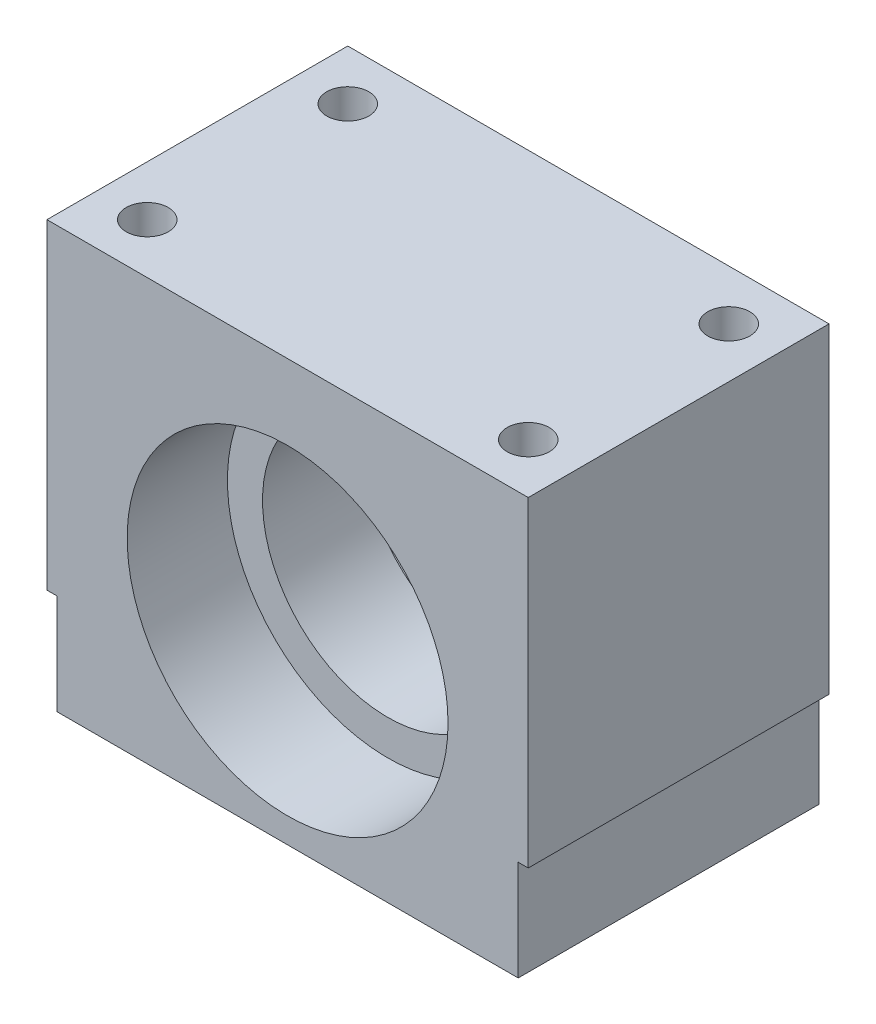
ISO-10303-21;
HEADER;
FILE_DESCRIPTION(('STEP AP214'),'2;1');
FILE_NAME('part.step','',(''),(''),'','','');
FILE_SCHEMA(('AUTOMOTIVE_DESIGN { 1 0 10303 214 1 1 1 1 }'));
ENDSEC;
DATA;
#1=APPLICATION_CONTEXT('core data for automotive mechanical design processes');
#2=APPLICATION_PROTOCOL_DEFINITION('international standard','automotive_design',2000,#1);
#3=PRODUCT_CONTEXT('',#1,'mechanical');
#4=PRODUCT('Part','Part','',(#3));
#5=PRODUCT_RELATED_PRODUCT_CATEGORY('part','',(#4));
#6=PRODUCT_DEFINITION_FORMATION('','',#4);
#7=PRODUCT_DEFINITION_CONTEXT('part definition',#1,'design');
#8=PRODUCT_DEFINITION('design','',#6,#7);
#9=PRODUCT_DEFINITION_SHAPE('','',#8);
#10=(LENGTH_UNIT() NAMED_UNIT(*) SI_UNIT(.MILLI.,.METRE.));
#11=(NAMED_UNIT(*) PLANE_ANGLE_UNIT() SI_UNIT($,.RADIAN.));
#12=(NAMED_UNIT(*) SI_UNIT($,.STERADIAN.) SOLID_ANGLE_UNIT());
#13=UNCERTAINTY_MEASURE_WITH_UNIT(LENGTH_MEASURE(1.E-05),#10,'distance_accuracy_value','');
#14=(GEOMETRIC_REPRESENTATION_CONTEXT(3) GLOBAL_UNCERTAINTY_ASSIGNED_CONTEXT((#13)) GLOBAL_UNIT_ASSIGNED_CONTEXT((#10,
#11,#12)) REPRESENTATION_CONTEXT('',''));
#15=CARTESIAN_POINT('',(0.,0.,0.));
#16=DIRECTION('',(0.,0.,1.));
#17=DIRECTION('',(1.,0.,0.));
#18=AXIS2_PLACEMENT_3D('',#15,#16,#17);
#19=CARTESIAN_POINT('',(0.,18.5,-15.));
#20=DIRECTION('',(0.,0.,1.));
#21=DIRECTION('',(1.,0.,0.));
#22=AXIS2_PLACEMENT_3D('',#19,#20,#21);
#23=CYLINDRICAL_SURFACE('',#22,12.5);
#24=CARTESIAN_POINT('',(0.,18.5,5.));
#25=DIRECTION('',(0.,0.,1.));
#26=DIRECTION('',(1.,0.,0.));
#27=AXIS2_PLACEMENT_3D('',#24,#25,#26);
#28=CIRCLE('',#27,12.5);
#29=CARTESIAN_POINT('',(12.5,18.5,5.));
#30=VERTEX_POINT('',#29);
#31=EDGE_CURVE('E191',#30,#30,#28,.F.);
#32=ORIENTED_EDGE('',*,*,#31,.F.);
#33=EDGE_LOOP('',(#32));
#34=FACE_BOUND('',#33,.T.);
#35=CARTESIAN_POINT('',(0.,18.5,-5.));
#36=DIRECTION('',(0.,0.,-1.));
#37=DIRECTION('',(-1.,0.,0.));
#38=AXIS2_PLACEMENT_3D('',#35,#36,#37);
#39=CIRCLE('',#38,12.5);
#40=CARTESIAN_POINT('',(-12.5,18.5,-5.));
#41=VERTEX_POINT('',#40);
#42=EDGE_CURVE('E36',#41,#41,#39,.F.);
#43=ORIENTED_EDGE('',*,*,#42,.F.);
#44=EDGE_LOOP('',(#43));
#45=FACE_BOUND('',#44,.T.);
#46=ADVANCED_FACE('F32',(#34,#45),#23,.F.);
#47=CARTESIAN_POINT('',(-24.,42.,-15.));
#48=DIRECTION('',(0.,0.,1.));
#49=DIRECTION('',(1.,0.,0.));
#50=AXIS2_PLACEMENT_3D('',#47,#48,#49);
#51=PLANE('',#50);
#52=DIRECTION('',(-1.,0.,0.));
#53=VECTOR('',#52,1.);
#54=CARTESIAN_POINT('',(-24.,0.,-15.));
#55=LINE('',#54,#53);
#56=CARTESIAN_POINT('',(23.,0.,-15.));
#57=VERTEX_POINT('',#56);
#58=CARTESIAN_POINT('',(-23.,0.,-15.));
#59=VERTEX_POINT('',#58);
#60=EDGE_CURVE('E132',#57,#59,#55,.T.);
#61=ORIENTED_EDGE('',*,*,#60,.T.);
#62=DIRECTION('',(0.,1.,0.));
#63=VECTOR('',#62,1.);
#64=CARTESIAN_POINT('',(-23.,10.,-15.));
#65=LINE('',#64,#63);
#66=CARTESIAN_POINT('',(-23.,10.,-15.));
#67=VERTEX_POINT('',#66);
#68=EDGE_CURVE('E49',#59,#67,#65,.T.);
#69=ORIENTED_EDGE('',*,*,#68,.T.);
#70=DIRECTION('',(-1.,0.,0.));
#71=VECTOR('',#70,1.);
#72=CARTESIAN_POINT('',(-24.,10.,-15.));
#73=LINE('',#72,#71);
#74=CARTESIAN_POINT('',(-24.,10.,-15.));
#75=VERTEX_POINT('',#74);
#76=EDGE_CURVE('E118',#67,#75,#73,.T.);
#77=ORIENTED_EDGE('',*,*,#76,.T.);
#78=DIRECTION('',(0.,-1.,0.));
#79=VECTOR('',#78,1.);
#80=CARTESIAN_POINT('',(-24.,42.,-15.));
#81=LINE('',#80,#79);
#82=CARTESIAN_POINT('',(-24.,42.,-15.));
#83=VERTEX_POINT('',#82);
#84=EDGE_CURVE('E41',#83,#75,#81,.T.);
#85=ORIENTED_EDGE('',*,*,#84,.F.);
#86=DIRECTION('',(-1.,0.,0.));
#87=VECTOR('',#86,1.);
#88=CARTESIAN_POINT('',(-24.,42.,-15.));
#89=LINE('',#88,#87);
#90=CARTESIAN_POINT('',(24.,42.,-15.));
#91=VERTEX_POINT('',#90);
#92=EDGE_CURVE('E198',#91,#83,#89,.T.);
#93=ORIENTED_EDGE('',*,*,#92,.F.);
#94=DIRECTION('',(0.,-1.,0.));
#95=VECTOR('',#94,1.);
#96=CARTESIAN_POINT('',(24.,42.,-15.));
#97=LINE('',#96,#95);
#98=CARTESIAN_POINT('',(24.,10.,-15.));
#99=VERTEX_POINT('',#98);
#100=EDGE_CURVE('E11',#91,#99,#97,.T.);
#101=ORIENTED_EDGE('',*,*,#100,.T.);
#102=DIRECTION('',(-1.,0.,0.));
#103=VECTOR('',#102,1.);
#104=CARTESIAN_POINT('',(24.,10.,-15.));
#105=LINE('',#104,#103);
#106=CARTESIAN_POINT('',(23.,10.,-15.));
#107=VERTEX_POINT('',#106);
#108=EDGE_CURVE('E142',#99,#107,#105,.T.);
#109=ORIENTED_EDGE('',*,*,#108,.T.);
#110=DIRECTION('',(0.,-1.,0.));
#111=VECTOR('',#110,1.);
#112=CARTESIAN_POINT('',(23.,10.,-15.));
#113=LINE('',#112,#111);
#114=EDGE_CURVE('E145',#107,#57,#113,.T.);
#115=ORIENTED_EDGE('',*,*,#114,.T.);
#116=EDGE_LOOP('',(#61,#69,#77,#85,#93,#101,#109,#115));
#117=FACE_BOUND('',#116,.T.);
#118=CARTESIAN_POINT('',(0.,18.5,-15.));
#119=DIRECTION('',(0.,0.,1.));
#120=DIRECTION('',(1.,0.,0.));
#121=AXIS2_PLACEMENT_3D('',#118,#119,#120);
#122=CIRCLE('',#121,16.);
#123=CARTESIAN_POINT('',(16.,18.5,-15.));
#124=VERTEX_POINT('',#123);
#125=EDGE_CURVE('E182',#124,#124,#122,.T.);
#126=ORIENTED_EDGE('',*,*,#125,.T.);
#127=EDGE_LOOP('',(#126));
#128=FACE_BOUND('',#127,.T.);
#129=ADVANCED_FACE('F128',(#117,#128),#51,.F.);
#130=CARTESIAN_POINT('',(24.,42.,15.));
#131=DIRECTION('',(-1.,0.,0.));
#132=DIRECTION('',(0.,0.,1.));
#133=AXIS2_PLACEMENT_3D('',#130,#131,#132);
#134=PLANE('',#133);
#135=DIRECTION('',(0.,-1.,0.));
#136=VECTOR('',#135,1.);
#137=CARTESIAN_POINT('',(24.,42.,15.));
#138=LINE('',#137,#136);
#139=CARTESIAN_POINT('',(24.,42.,15.));
#140=VERTEX_POINT('',#139);
#141=CARTESIAN_POINT('',(24.,10.,15.));
#142=VERTEX_POINT('',#141);
#143=EDGE_CURVE('E204',#140,#142,#138,.T.);
#144=ORIENTED_EDGE('',*,*,#143,.T.);
#145=DIRECTION('',(0.,0.,1.));
#146=VECTOR('',#145,1.);
#147=CARTESIAN_POINT('',(24.,10.,-15.));
#148=LINE('',#147,#146);
#149=EDGE_CURVE('E148',#99,#142,#148,.T.);
#150=ORIENTED_EDGE('',*,*,#149,.F.);
#151=ORIENTED_EDGE('',*,*,#100,.F.);
#152=DIRECTION('',(0.,0.,-1.));
#153=VECTOR('',#152,1.);
#154=CARTESIAN_POINT('',(24.,42.,15.));
#155=LINE('',#154,#153);
#156=EDGE_CURVE('E195',#140,#91,#155,.T.);
#157=ORIENTED_EDGE('',*,*,#156,.F.);
#158=EDGE_LOOP('',(#144,#150,#151,#157));
#159=FACE_BOUND('',#158,.T.);
#160=ADVANCED_FACE('F34',(#159),#134,.F.);
#161=CARTESIAN_POINT('',(-24.,42.,15.));
#162=DIRECTION('',(1.,0.,0.));
#163=DIRECTION('',(0.,0.,-1.));
#164=AXIS2_PLACEMENT_3D('',#161,#162,#163);
#165=PLANE('',#164);
#166=ORIENTED_EDGE('',*,*,#84,.T.);
#167=DIRECTION('',(0.,0.,1.));
#168=VECTOR('',#167,1.);
#169=CARTESIAN_POINT('',(-24.,10.,-15.));
#170=LINE('',#169,#168);
#171=CARTESIAN_POINT('',(-24.,10.,15.));
#172=VERTEX_POINT('',#171);
#173=EDGE_CURVE('E117',#75,#172,#170,.T.);
#174=ORIENTED_EDGE('',*,*,#173,.T.);
#175=DIRECTION('',(0.,-1.,0.));
#176=VECTOR('',#175,1.);
#177=CARTESIAN_POINT('',(-24.,42.,15.));
#178=LINE('',#177,#176);
#179=CARTESIAN_POINT('',(-24.,42.,15.));
#180=VERTEX_POINT('',#179);
#181=EDGE_CURVE('E209',#180,#172,#178,.T.);
#182=ORIENTED_EDGE('',*,*,#181,.F.);
#183=DIRECTION('',(0.,0.,1.));
#184=VECTOR('',#183,1.);
#185=CARTESIAN_POINT('',(-24.,42.,15.));
#186=LINE('',#185,#184);
#187=EDGE_CURVE('E200',#83,#180,#186,.T.);
#188=ORIENTED_EDGE('',*,*,#187,.F.);
#189=EDGE_LOOP('',(#166,#174,#182,#188));
#190=FACE_BOUND('',#189,.T.);
#191=ADVANCED_FACE('F256',(#190),#165,.F.);
#192=CARTESIAN_POINT('',(-24.,42.,15.));
#193=DIRECTION('',(0.,0.,-1.));
#194=DIRECTION('',(-1.,0.,0.));
#195=AXIS2_PLACEMENT_3D('',#192,#193,#194);
#196=PLANE('',#195);
#197=CARTESIAN_POINT('',(0.,18.5,15.));
#198=DIRECTION('',(0.,0.,1.));
#199=DIRECTION('',(1.,0.,0.));
#200=AXIS2_PLACEMENT_3D('',#197,#198,#199);
#201=CIRCLE('',#200,16.);
#202=CARTESIAN_POINT('',(16.,18.5,15.));
#203=VERTEX_POINT('',#202);
#204=EDGE_CURVE('E192',#203,#203,#201,.T.);
#205=ORIENTED_EDGE('',*,*,#204,.F.);
#206=EDGE_LOOP('',(#205));
#207=FACE_BOUND('',#206,.T.);
#208=DIRECTION('',(-1.,0.,0.));
#209=VECTOR('',#208,1.);
#210=CARTESIAN_POINT('',(-24.,10.,15.));
#211=LINE('',#210,#209);
#212=CARTESIAN_POINT('',(-23.,10.,15.));
#213=VERTEX_POINT('',#212);
#214=EDGE_CURVE('E133',#213,#172,#211,.T.);
#215=ORIENTED_EDGE('',*,*,#214,.F.);
#216=DIRECTION('',(0.,1.,0.));
#217=VECTOR('',#216,1.);
#218=CARTESIAN_POINT('',(-23.,10.,15.));
#219=LINE('',#218,#217);
#220=CARTESIAN_POINT('',(-23.,0.,15.));
#221=VERTEX_POINT('',#220);
#222=EDGE_CURVE('E114',#221,#213,#219,.T.);
#223=ORIENTED_EDGE('',*,*,#222,.F.);
#224=DIRECTION('',(1.,0.,0.));
#225=VECTOR('',#224,1.);
#226=CARTESIAN_POINT('',(-24.,0.,15.));
#227=LINE('',#226,#225);
#228=CARTESIAN_POINT('',(23.,0.,15.));
#229=VERTEX_POINT('',#228);
#230=EDGE_CURVE('E57',#221,#229,#227,.T.);
#231=ORIENTED_EDGE('',*,*,#230,.T.);
#232=DIRECTION('',(0.,-1.,0.));
#233=VECTOR('',#232,1.);
#234=CARTESIAN_POINT('',(23.,10.,15.));
#235=LINE('',#234,#233);
#236=CARTESIAN_POINT('',(23.,10.,15.));
#237=VERTEX_POINT('',#236);
#238=EDGE_CURVE('E146',#237,#229,#235,.T.);
#239=ORIENTED_EDGE('',*,*,#238,.F.);
#240=DIRECTION('',(-1.,0.,0.));
#241=VECTOR('',#240,1.);
#242=CARTESIAN_POINT('',(24.,10.,15.));
#243=LINE('',#242,#241);
#244=EDGE_CURVE('E140',#142,#237,#243,.T.);
#245=ORIENTED_EDGE('',*,*,#244,.F.);
#246=ORIENTED_EDGE('',*,*,#143,.F.);
#247=DIRECTION('',(1.,0.,0.));
#248=VECTOR('',#247,1.);
#249=CARTESIAN_POINT('',(-24.,42.,15.));
#250=LINE('',#249,#248);
#251=EDGE_CURVE('E202',#180,#140,#250,.T.);
#252=ORIENTED_EDGE('',*,*,#251,.F.);
#253=ORIENTED_EDGE('',*,*,#181,.T.);
#254=EDGE_LOOP('',(#215,#223,#231,#239,#245,#246,#252,#253));
#255=FACE_BOUND('',#254,.T.);
#256=ADVANCED_FACE('F249',(#207,#255),#196,.F.);
#257=CARTESIAN_POINT('',(0.,42.,0.));
#258=DIRECTION('',(0.,-1.,0.));
#259=DIRECTION('',(0.,0.,-1.));
#260=AXIS2_PLACEMENT_3D('',#257,#258,#259);
#261=PLANE('',#260);
#262=CARTESIAN_POINT('',(-19.,42.,10.));
#263=DIRECTION('',(0.,1.,0.));
#264=DIRECTION('',(0.,0.,1.));
#265=AXIS2_PLACEMENT_3D('',#262,#263,#264);
#266=CIRCLE('',#265,2.09999999999999);
#267=CARTESIAN_POINT('',(-19.,42.,12.1));
#268=VERTEX_POINT('',#267);
#269=EDGE_CURVE('E155',#268,#268,#266,.T.);
#270=ORIENTED_EDGE('',*,*,#269,.F.);
#271=EDGE_LOOP('',(#270));
#272=FACE_BOUND('',#271,.T.);
#273=CARTESIAN_POINT('',(-19.,42.,-10.));
#274=DIRECTION('',(0.,1.,0.));
#275=DIRECTION('',(0.,0.,1.));
#276=AXIS2_PLACEMENT_3D('',#273,#274,#275);
#277=CIRCLE('',#276,2.09999999999999);
#278=CARTESIAN_POINT('',(-19.,42.,-7.90000000000001));
#279=VERTEX_POINT('',#278);
#280=EDGE_CURVE('E164',#279,#279,#277,.T.);
#281=ORIENTED_EDGE('',*,*,#280,.F.);
#282=EDGE_LOOP('',(#281));
#283=FACE_BOUND('',#282,.T.);
#284=CARTESIAN_POINT('',(19.,42.,10.));
#285=DIRECTION('',(0.,1.,0.));
#286=DIRECTION('',(0.,0.,1.));
#287=AXIS2_PLACEMENT_3D('',#284,#285,#286);
#288=CIRCLE('',#287,2.09999999999999);
#289=CARTESIAN_POINT('',(19.,42.,12.1));
#290=VERTEX_POINT('',#289);
#291=EDGE_CURVE('E170',#290,#290,#288,.T.);
#292=ORIENTED_EDGE('',*,*,#291,.F.);
#293=EDGE_LOOP('',(#292));
#294=FACE_BOUND('',#293,.T.);
#295=CARTESIAN_POINT('',(19.,42.,-10.));
#296=DIRECTION('',(0.,1.,0.));
#297=DIRECTION('',(0.,0.,1.));
#298=AXIS2_PLACEMENT_3D('',#295,#296,#297);
#299=CIRCLE('',#298,2.09999999999999);
#300=CARTESIAN_POINT('',(19.,42.,-7.90000000000001));
#301=VERTEX_POINT('',#300);
#302=EDGE_CURVE('E176',#301,#301,#299,.T.);
#303=ORIENTED_EDGE('',*,*,#302,.F.);
#304=EDGE_LOOP('',(#303));
#305=FACE_BOUND('',#304,.T.);
#306=ORIENTED_EDGE('',*,*,#156,.T.);
#307=ORIENTED_EDGE('',*,*,#92,.T.);
#308=ORIENTED_EDGE('',*,*,#187,.T.);
#309=ORIENTED_EDGE('',*,*,#251,.T.);
#310=EDGE_LOOP('',(#306,#307,#308,#309));
#311=FACE_BOUND('',#310,.T.);
#312=ADVANCED_FACE('F246',(#272,#283,#294,#305,#311),#261,.F.);
#313=CARTESIAN_POINT('',(0.,0.,0.));
#314=DIRECTION('',(0.,-1.,0.));
#315=DIRECTION('',(0.,0.,-1.));
#316=AXIS2_PLACEMENT_3D('',#313,#314,#315);
#317=PLANE('',#316);
#318=DIRECTION('',(0.,0.,1.));
#319=VECTOR('',#318,1.);
#320=CARTESIAN_POINT('',(-23.,0.,-15.));
#321=LINE('',#320,#319);
#322=EDGE_CURVE('E138',#59,#221,#321,.T.);
#323=ORIENTED_EDGE('',*,*,#322,.F.);
#324=ORIENTED_EDGE('',*,*,#60,.F.);
#325=DIRECTION('',(0.,0.,1.));
#326=VECTOR('',#325,1.);
#327=CARTESIAN_POINT('',(23.,0.,-15.));
#328=LINE('',#327,#326);
#329=EDGE_CURVE('E152',#57,#229,#328,.T.);
#330=ORIENTED_EDGE('',*,*,#329,.T.);
#331=ORIENTED_EDGE('',*,*,#230,.F.);
#332=EDGE_LOOP('',(#323,#324,#330,#331));
#333=FACE_BOUND('',#332,.T.);
#334=ADVANCED_FACE('F243',(#333),#317,.T.);
#335=CARTESIAN_POINT('',(0.,18.5,5.));
#336=DIRECTION('',(0.,0.,1.));
#337=DIRECTION('',(1.,0.,0.));
#338=AXIS2_PLACEMENT_3D('',#335,#336,#337);
#339=PLANE('',#338);
#340=CARTESIAN_POINT('',(0.,18.5,5.));
#341=DIRECTION('',(0.,0.,1.));
#342=DIRECTION('',(1.,0.,0.));
#343=AXIS2_PLACEMENT_3D('',#340,#341,#342);
#344=CIRCLE('',#343,16.);
#345=CARTESIAN_POINT('',(16.,18.5,5.));
#346=VERTEX_POINT('',#345);
#347=EDGE_CURVE('E188',#346,#346,#344,.T.);
#348=ORIENTED_EDGE('',*,*,#347,.T.);
#349=EDGE_LOOP('',(#348));
#350=FACE_BOUND('',#349,.T.);
#351=ORIENTED_EDGE('',*,*,#31,.T.);
#352=EDGE_LOOP('',(#351));
#353=FACE_BOUND('',#352,.T.);
#354=ADVANCED_FACE('F215',(#350,#353),#339,.T.);
#355=CARTESIAN_POINT('',(0.,18.5,5.));
#356=DIRECTION('',(0.,0.,1.));
#357=DIRECTION('',(1.,0.,0.));
#358=AXIS2_PLACEMENT_3D('',#355,#356,#357);
#359=CYLINDRICAL_SURFACE('',#358,16.);
#360=ORIENTED_EDGE('',*,*,#347,.F.);
#361=EDGE_LOOP('',(#360));
#362=FACE_BOUND('',#361,.T.);
#363=ORIENTED_EDGE('',*,*,#204,.T.);
#364=EDGE_LOOP('',(#363));
#365=FACE_BOUND('',#364,.T.);
#366=ADVANCED_FACE('F226',(#362,#365),#359,.F.);
#367=CARTESIAN_POINT('',(0.,18.5,-5.));
#368=DIRECTION('',(0.,0.,-1.));
#369=DIRECTION('',(1.,0.,0.));
#370=AXIS2_PLACEMENT_3D('',#367,#368,#369);
#371=PLANE('',#370);
#372=CARTESIAN_POINT('',(0.,18.5,-5.));
#373=DIRECTION('',(0.,0.,1.));
#374=DIRECTION('',(1.,0.,0.));
#375=AXIS2_PLACEMENT_3D('',#372,#373,#374);
#376=CIRCLE('',#375,16.);
#377=CARTESIAN_POINT('',(16.,18.5,-5.));
#378=VERTEX_POINT('',#377);
#379=EDGE_CURVE('E183',#378,#378,#376,.T.);
#380=ORIENTED_EDGE('',*,*,#379,.F.);
#381=EDGE_LOOP('',(#380));
#382=FACE_BOUND('',#381,.T.);
#383=ORIENTED_EDGE('',*,*,#42,.T.);
#384=EDGE_LOOP('',(#383));
#385=FACE_BOUND('',#384,.T.);
#386=ADVANCED_FACE('F223',(#382,#385),#371,.T.);
#387=CARTESIAN_POINT('',(0.,18.5,-5.));
#388=DIRECTION('',(0.,0.,-1.));
#389=DIRECTION('',(-1.,0.,0.));
#390=AXIS2_PLACEMENT_3D('',#387,#388,#389);
#391=CYLINDRICAL_SURFACE('',#390,16.);
#392=ORIENTED_EDGE('',*,*,#379,.T.);
#393=EDGE_LOOP('',(#392));
#394=FACE_BOUND('',#393,.T.);
#395=ORIENTED_EDGE('',*,*,#125,.F.);
#396=EDGE_LOOP('',(#395));
#397=FACE_BOUND('',#396,.T.);
#398=ADVANCED_FACE('F225',(#394,#397),#391,.F.);
#399=CARTESIAN_POINT('',(19.,7.,-10.));
#400=DIRECTION('',(0.,1.,0.));
#401=DIRECTION('',(0.,0.,1.));
#402=AXIS2_PLACEMENT_3D('',#399,#400,#401);
#403=CONICAL_SURFACE('',#402,2.09999999999998,1.02974425867665);
#404=CARTESIAN_POINT('',(19.,5.73819270004212,-10.));
#405=VERTEX_POINT('',#404);
#406=VERTEX_LOOP('',#405);
#407=FACE_BOUND('',#406,.T.);
#408=CARTESIAN_POINT('',(19.,7.,-10.));
#409=DIRECTION('',(0.,1.,0.));
#410=DIRECTION('',(0.,0.,1.));
#411=AXIS2_PLACEMENT_3D('',#408,#409,#410);
#412=CIRCLE('',#411,2.09999999999998);
#413=CARTESIAN_POINT('',(19.,7.,-7.90000000000001));
#414=VERTEX_POINT('',#413);
#415=EDGE_CURVE('E179',#414,#414,#412,.T.);
#416=ORIENTED_EDGE('',*,*,#415,.T.);
#417=EDGE_LOOP('',(#416));
#418=FACE_BOUND('',#417,.T.);
#419=ADVANCED_FACE('F233',(#407,#418),#403,.F.);
#420=CARTESIAN_POINT('',(19.,42.,-10.));
#421=DIRECTION('',(0.,1.,0.));
#422=DIRECTION('',(0.,0.,1.));
#423=AXIS2_PLACEMENT_3D('',#420,#421,#422);
#424=CYLINDRICAL_SURFACE('',#423,2.09999999999999);
#425=ORIENTED_EDGE('',*,*,#415,.F.);
#426=EDGE_LOOP('',(#425));
#427=FACE_BOUND('',#426,.T.);
#428=ORIENTED_EDGE('',*,*,#302,.T.);
#429=EDGE_LOOP('',(#428));
#430=FACE_BOUND('',#429,.T.);
#431=ADVANCED_FACE('F312',(#427,#430),#424,.F.);
#432=CARTESIAN_POINT('',(19.,7.,10.));
#433=DIRECTION('',(0.,1.,0.));
#434=DIRECTION('',(0.,0.,1.));
#435=AXIS2_PLACEMENT_3D('',#432,#433,#434);
#436=CONICAL_SURFACE('',#435,2.09999999999998,1.02974425867665);
#437=CARTESIAN_POINT('',(19.,5.73819270004212,10.));
#438=VERTEX_POINT('',#437);
#439=VERTEX_LOOP('',#438);
#440=FACE_BOUND('',#439,.T.);
#441=CARTESIAN_POINT('',(19.,7.,10.));
#442=DIRECTION('',(0.,1.,0.));
#443=DIRECTION('',(0.,0.,1.));
#444=AXIS2_PLACEMENT_3D('',#441,#442,#443);
#445=CIRCLE('',#444,2.09999999999998);
#446=CARTESIAN_POINT('',(19.,7.,12.1));
#447=VERTEX_POINT('',#446);
#448=EDGE_CURVE('E173',#447,#447,#445,.T.);
#449=ORIENTED_EDGE('',*,*,#448,.T.);
#450=EDGE_LOOP('',(#449));
#451=FACE_BOUND('',#450,.T.);
#452=ADVANCED_FACE('F309',(#440,#451),#436,.F.);
#453=CARTESIAN_POINT('',(19.,42.,10.));
#454=DIRECTION('',(0.,1.,0.));
#455=DIRECTION('',(0.,0.,1.));
#456=AXIS2_PLACEMENT_3D('',#453,#454,#455);
#457=CYLINDRICAL_SURFACE('',#456,2.09999999999999);
#458=ORIENTED_EDGE('',*,*,#448,.F.);
#459=EDGE_LOOP('',(#458));
#460=FACE_BOUND('',#459,.T.);
#461=ORIENTED_EDGE('',*,*,#291,.T.);
#462=EDGE_LOOP('',(#461));
#463=FACE_BOUND('',#462,.T.);
#464=ADVANCED_FACE('F305',(#460,#463),#457,.F.);
#465=CARTESIAN_POINT('',(-19.,7.,-10.));
#466=DIRECTION('',(0.,1.,0.));
#467=DIRECTION('',(0.,0.,1.));
#468=AXIS2_PLACEMENT_3D('',#465,#466,#467);
#469=CONICAL_SURFACE('',#468,2.09999999999998,1.02974425867665);
#470=CARTESIAN_POINT('',(-19.,5.73819270004212,-10.));
#471=VERTEX_POINT('',#470);
#472=VERTEX_LOOP('',#471);
#473=FACE_BOUND('',#472,.T.);
#474=CARTESIAN_POINT('',(-19.,7.,-10.));
#475=DIRECTION('',(0.,1.,0.));
#476=DIRECTION('',(0.,0.,1.));
#477=AXIS2_PLACEMENT_3D('',#474,#475,#476);
#478=CIRCLE('',#477,2.09999999999998);
#479=CARTESIAN_POINT('',(-19.,7.,-7.90000000000001));
#480=VERTEX_POINT('',#479);
#481=EDGE_CURVE('E167',#480,#480,#478,.T.);
#482=ORIENTED_EDGE('',*,*,#481,.T.);
#483=EDGE_LOOP('',(#482));
#484=FACE_BOUND('',#483,.T.);
#485=ADVANCED_FACE('F301',(#473,#484),#469,.F.);
#486=CARTESIAN_POINT('',(-19.,42.,-10.));
#487=DIRECTION('',(0.,1.,0.));
#488=DIRECTION('',(0.,0.,1.));
#489=AXIS2_PLACEMENT_3D('',#486,#487,#488);
#490=CYLINDRICAL_SURFACE('',#489,2.09999999999999);
#491=ORIENTED_EDGE('',*,*,#481,.F.);
#492=EDGE_LOOP('',(#491));
#493=FACE_BOUND('',#492,.T.);
#494=ORIENTED_EDGE('',*,*,#280,.T.);
#495=EDGE_LOOP('',(#494));
#496=FACE_BOUND('',#495,.T.);
#497=ADVANCED_FACE('F297',(#493,#496),#490,.F.);
#498=CARTESIAN_POINT('',(-19.,7.,10.));
#499=DIRECTION('',(0.,1.,0.));
#500=DIRECTION('',(0.,0.,1.));
#501=AXIS2_PLACEMENT_3D('',#498,#499,#500);
#502=CONICAL_SURFACE('',#501,2.09999999999998,1.02974425867665);
#503=CARTESIAN_POINT('',(-19.,5.73819270004212,10.));
#504=VERTEX_POINT('',#503);
#505=VERTEX_LOOP('',#504);
#506=FACE_BOUND('',#505,.T.);
#507=CARTESIAN_POINT('',(-19.,7.,10.));
#508=DIRECTION('',(0.,1.,0.));
#509=DIRECTION('',(0.,0.,1.));
#510=AXIS2_PLACEMENT_3D('',#507,#508,#509);
#511=CIRCLE('',#510,2.09999999999998);
#512=CARTESIAN_POINT('',(-19.,7.,12.1));
#513=VERTEX_POINT('',#512);
#514=EDGE_CURVE('E161',#513,#513,#511,.T.);
#515=ORIENTED_EDGE('',*,*,#514,.T.);
#516=EDGE_LOOP('',(#515));
#517=FACE_BOUND('',#516,.T.);
#518=ADVANCED_FACE('F289',(#506,#517),#502,.F.);
#519=CARTESIAN_POINT('',(-19.,42.,10.));
#520=DIRECTION('',(0.,1.,0.));
#521=DIRECTION('',(0.,0.,1.));
#522=AXIS2_PLACEMENT_3D('',#519,#520,#521);
#523=CYLINDRICAL_SURFACE('',#522,2.09999999999999);
#524=ORIENTED_EDGE('',*,*,#514,.F.);
#525=EDGE_LOOP('',(#524));
#526=FACE_BOUND('',#525,.T.);
#527=ORIENTED_EDGE('',*,*,#269,.T.);
#528=EDGE_LOOP('',(#527));
#529=FACE_BOUND('',#528,.T.);
#530=ADVANCED_FACE('F282',(#526,#529),#523,.F.);
#531=CARTESIAN_POINT('',(23.,10.,-15.));
#532=DIRECTION('',(-1.,0.,0.));
#533=DIRECTION('',(0.,0.,1.));
#534=AXIS2_PLACEMENT_3D('',#531,#532,#533);
#535=PLANE('',#534);
#536=ORIENTED_EDGE('',*,*,#238,.T.);
#537=ORIENTED_EDGE('',*,*,#329,.F.);
#538=ORIENTED_EDGE('',*,*,#114,.F.);
#539=DIRECTION('',(0.,0.,1.));
#540=VECTOR('',#539,1.);
#541=CARTESIAN_POINT('',(23.,10.,-15.));
#542=LINE('',#541,#540);
#543=EDGE_CURVE('E156',#107,#237,#542,.T.);
#544=ORIENTED_EDGE('',*,*,#543,.T.);
#545=EDGE_LOOP('',(#536,#537,#538,#544));
#546=FACE_BOUND('',#545,.T.);
#547=ADVANCED_FACE('F280',(#546),#535,.F.);
#548=CARTESIAN_POINT('',(24.,10.,-15.));
#549=DIRECTION('',(0.,1.,0.));
#550=DIRECTION('',(0.,0.,1.));
#551=AXIS2_PLACEMENT_3D('',#548,#549,#550);
#552=PLANE('',#551);
#553=ORIENTED_EDGE('',*,*,#244,.T.);
#554=ORIENTED_EDGE('',*,*,#543,.F.);
#555=ORIENTED_EDGE('',*,*,#108,.F.);
#556=ORIENTED_EDGE('',*,*,#149,.T.);
#557=EDGE_LOOP('',(#553,#554,#555,#556));
#558=FACE_BOUND('',#557,.T.);
#559=ADVANCED_FACE('F274',(#558),#552,.F.);
#560=CARTESIAN_POINT('',(-23.,10.,-15.));
#561=DIRECTION('',(1.,0.,0.));
#562=DIRECTION('',(0.,0.,-1.));
#563=AXIS2_PLACEMENT_3D('',#560,#561,#562);
#564=PLANE('',#563);
#565=ORIENTED_EDGE('',*,*,#222,.T.);
#566=DIRECTION('',(0.,0.,1.));
#567=VECTOR('',#566,1.);
#568=CARTESIAN_POINT('',(-23.,10.,-15.));
#569=LINE('',#568,#567);
#570=EDGE_CURVE('E111',#67,#213,#569,.T.);
#571=ORIENTED_EDGE('',*,*,#570,.F.);
#572=ORIENTED_EDGE('',*,*,#68,.F.);
#573=ORIENTED_EDGE('',*,*,#322,.T.);
#574=EDGE_LOOP('',(#565,#571,#572,#573));
#575=FACE_BOUND('',#574,.T.);
#576=ADVANCED_FACE('F113',(#575),#564,.F.);
#577=CARTESIAN_POINT('',(-24.,10.,-15.));
#578=DIRECTION('',(0.,1.,0.));
#579=DIRECTION('',(0.,0.,1.));
#580=AXIS2_PLACEMENT_3D('',#577,#578,#579);
#581=PLANE('',#580);
#582=ORIENTED_EDGE('',*,*,#214,.T.);
#583=ORIENTED_EDGE('',*,*,#173,.F.);
#584=ORIENTED_EDGE('',*,*,#76,.F.);
#585=ORIENTED_EDGE('',*,*,#570,.T.);
#586=EDGE_LOOP('',(#582,#583,#584,#585));
#587=FACE_BOUND('',#586,.T.);
#588=ADVANCED_FACE('F121',(#587),#581,.F.);
#589=CLOSED_SHELL('',(#46,#129,#160,#191,#256,#312,#334,#354,#366,#386,#398,#419,#431,#452,#464,
#485,#497,#518,#530,#547,#559,#576,#588));
#590=MANIFOLD_SOLID_BREP('B2',#589);
#591=ADVANCED_BREP_SHAPE_REPRESENTATION('',(#18,#590),#14);
#592=SHAPE_DEFINITION_REPRESENTATION(#9,#591);
ENDSEC;
END-ISO-10303-21;
